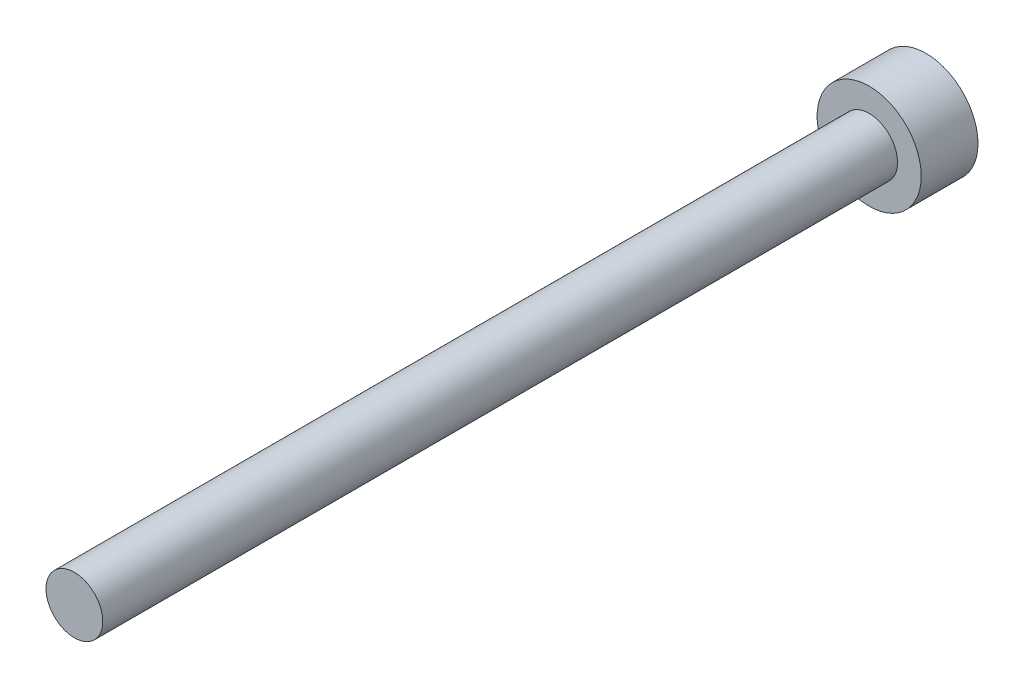
ISO-10303-21;
HEADER;
FILE_DESCRIPTION(('STEP AP214'),'2;1');
FILE_NAME('part.step','',(''),(''),'','','');
FILE_SCHEMA(('AUTOMOTIVE_DESIGN { 1 0 10303 214 1 1 1 1 }'));
ENDSEC;
DATA;
#1=APPLICATION_CONTEXT('core data for automotive mechanical design processes');
#2=APPLICATION_PROTOCOL_DEFINITION('international standard','automotive_design',2000,#1);
#3=PRODUCT_CONTEXT('',#1,'mechanical');
#4=PRODUCT('Part','Part','',(#3));
#5=PRODUCT_RELATED_PRODUCT_CATEGORY('part','',(#4));
#6=PRODUCT_DEFINITION_FORMATION('','',#4);
#7=PRODUCT_DEFINITION_CONTEXT('part definition',#1,'design');
#8=PRODUCT_DEFINITION('design','',#6,#7);
#9=PRODUCT_DEFINITION_SHAPE('','',#8);
#10=(LENGTH_UNIT() NAMED_UNIT(*) SI_UNIT(.MILLI.,.METRE.));
#11=(NAMED_UNIT(*) PLANE_ANGLE_UNIT() SI_UNIT($,.RADIAN.));
#12=(NAMED_UNIT(*) SI_UNIT($,.STERADIAN.) SOLID_ANGLE_UNIT());
#13=UNCERTAINTY_MEASURE_WITH_UNIT(LENGTH_MEASURE(1.E-05),#10,'distance_accuracy_value','');
#14=(GEOMETRIC_REPRESENTATION_CONTEXT(3) GLOBAL_UNCERTAINTY_ASSIGNED_CONTEXT((#13)) GLOBAL_UNIT_ASSIGNED_CONTEXT((#10,
#11,#12)) REPRESENTATION_CONTEXT('',''));
#15=CARTESIAN_POINT('',(0.,0.,0.));
#16=DIRECTION('',(0.,0.,1.));
#17=DIRECTION('',(1.,0.,0.));
#18=AXIS2_PLACEMENT_3D('',#15,#16,#17);
#19=CARTESIAN_POINT('',(0.,0.,-3.));
#20=DIRECTION('',(0.,0.,1.));
#21=DIRECTION('',(1.,0.,0.));
#22=AXIS2_PLACEMENT_3D('',#19,#20,#21);
#23=PLANE('',#22);
#24=CARTESIAN_POINT('',(0.,0.,-3.));
#25=DIRECTION('',(0.,0.,1.));
#26=DIRECTION('',(1.,0.,0.));
#27=AXIS2_PLACEMENT_3D('',#24,#25,#26);
#28=CIRCLE('',#27,2.75);
#29=CARTESIAN_POINT('',(2.75,0.,-3.));
#30=VERTEX_POINT('',#29);
#31=EDGE_CURVE('E112',#30,#30,#28,.T.);
#32=ORIENTED_EDGE('',*,*,#31,.F.);
#33=EDGE_LOOP('',(#32));
#34=FACE_BOUND('',#33,.T.);
#35=DIRECTION('',(-0.5,-0.866025403784439,0.));
#36=VECTOR('',#35,1.);
#37=CARTESIAN_POINT('',(1.08253175473055,-0.625,-3.));
#38=LINE('',#37,#36);
#39=CARTESIAN_POINT('',(1.44337567297406,0.,-3.));
#40=VERTEX_POINT('',#39);
#41=CARTESIAN_POINT('',(0.721687836487032,-1.25,-3.));
#42=VERTEX_POINT('',#41);
#43=EDGE_CURVE('E11',#40,#42,#38,.T.);
#44=ORIENTED_EDGE('',*,*,#43,.F.);
#45=DIRECTION('',(0.5,-0.866025403784439,0.));
#46=VECTOR('',#45,1.);
#47=CARTESIAN_POINT('',(1.08253175473055,0.625,-3.));
#48=LINE('',#47,#46);
#49=CARTESIAN_POINT('',(0.721687836487032,1.25,-3.));
#50=VERTEX_POINT('',#49);
#51=EDGE_CURVE('E50',#50,#40,#48,.T.);
#52=ORIENTED_EDGE('',*,*,#51,.F.);
#53=DIRECTION('',(1.,0.,0.));
#54=VECTOR('',#53,1.);
#55=CARTESIAN_POINT('',(0.,1.25,-3.));
#56=LINE('',#55,#54);
#57=CARTESIAN_POINT('',(-0.721687836487032,1.25,-3.));
#58=VERTEX_POINT('',#57);
#59=EDGE_CURVE('E133',#58,#50,#56,.T.);
#60=ORIENTED_EDGE('',*,*,#59,.F.);
#61=DIRECTION('',(0.5,0.866025403784439,0.));
#62=VECTOR('',#61,1.);
#63=CARTESIAN_POINT('',(-1.08253175473055,0.625,-3.));
#64=LINE('',#63,#62);
#65=CARTESIAN_POINT('',(-1.44337567297406,0.,-3.));
#66=VERTEX_POINT('',#65);
#67=EDGE_CURVE('E129',#66,#58,#64,.T.);
#68=ORIENTED_EDGE('',*,*,#67,.F.);
#69=DIRECTION('',(-0.5,0.866025403784439,0.));
#70=VECTOR('',#69,1.);
#71=CARTESIAN_POINT('',(-1.08253175473055,-0.624999999999999,-3.));
#72=LINE('',#71,#70);
#73=CARTESIAN_POINT('',(-0.721687836487033,-1.25,-3.));
#74=VERTEX_POINT('',#73);
#75=EDGE_CURVE('E130',#74,#66,#72,.T.);
#76=ORIENTED_EDGE('',*,*,#75,.F.);
#77=DIRECTION('',(-1.,0.,0.));
#78=VECTOR('',#77,1.);
#79=CARTESIAN_POINT('',(0.,-1.25,-3.));
#80=LINE('',#79,#78);
#81=EDGE_CURVE('E116',#42,#74,#80,.T.);
#82=ORIENTED_EDGE('',*,*,#81,.F.);
#83=EDGE_LOOP('',(#44,#52,#60,#68,#76,#82));
#84=FACE_BOUND('',#83,.T.);
#85=ADVANCED_FACE('F39',(#34,#84),#23,.F.);
#86=CARTESIAN_POINT('',(0.,0.,0.));
#87=DIRECTION('',(0.,0.,-1.));
#88=DIRECTION('',(-1.,0.,0.));
#89=AXIS2_PLACEMENT_3D('',#86,#87,#88);
#90=CYLINDRICAL_SURFACE('',#89,2.75);
#91=CARTESIAN_POINT('',(0.,0.,0.));
#92=DIRECTION('',(0.,0.,1.));
#93=DIRECTION('',(1.,0.,0.));
#94=AXIS2_PLACEMENT_3D('',#91,#92,#93);
#95=CIRCLE('',#94,2.75);
#96=CARTESIAN_POINT('',(2.75,0.,0.));
#97=VERTEX_POINT('',#96);
#98=EDGE_CURVE('E121',#97,#97,#95,.T.);
#99=ORIENTED_EDGE('',*,*,#98,.F.);
#100=EDGE_LOOP('',(#99));
#101=FACE_BOUND('',#100,.T.);
#102=ORIENTED_EDGE('',*,*,#31,.T.);
#103=EDGE_LOOP('',(#102));
#104=FACE_BOUND('',#103,.T.);
#105=ADVANCED_FACE('F41',(#101,#104),#90,.T.);
#106=CARTESIAN_POINT('',(0.,0.,0.));
#107=DIRECTION('',(0.,0.,1.));
#108=DIRECTION('',(1.,0.,0.));
#109=AXIS2_PLACEMENT_3D('',#106,#107,#108);
#110=PLANE('',#109);
#111=CARTESIAN_POINT('',(0.,0.,0.));
#112=DIRECTION('',(0.,0.,1.));
#113=DIRECTION('',(1.,0.,0.));
#114=AXIS2_PLACEMENT_3D('',#111,#112,#113);
#115=CIRCLE('',#114,1.5);
#116=CARTESIAN_POINT('',(-1.5,0.,0.));
#117=VERTEX_POINT('',#116);
#118=EDGE_CURVE('E119',#117,#117,#115,.T.);
#119=ORIENTED_EDGE('',*,*,#118,.F.);
#120=EDGE_LOOP('',(#119));
#121=FACE_BOUND('',#120,.T.);
#122=ORIENTED_EDGE('',*,*,#98,.T.);
#123=EDGE_LOOP('',(#122));
#124=FACE_BOUND('',#123,.T.);
#125=ADVANCED_FACE('F177',(#121,#124),#110,.T.);
#126=CARTESIAN_POINT('',(0.,0.,42.));
#127=DIRECTION('',(0.,0.,-1.));
#128=DIRECTION('',(-1.,0.,0.));
#129=AXIS2_PLACEMENT_3D('',#126,#127,#128);
#130=CYLINDRICAL_SURFACE('',#129,1.5);
#131=CARTESIAN_POINT('',(0.,0.,42.));
#132=DIRECTION('',(0.,0.,1.));
#133=DIRECTION('',(1.,0.,0.));
#134=AXIS2_PLACEMENT_3D('',#131,#132,#133);
#135=CIRCLE('',#134,1.5);
#136=CARTESIAN_POINT('',(-1.5,0.,42.));
#137=VERTEX_POINT('',#136);
#138=EDGE_CURVE('E110',#137,#137,#135,.T.);
#139=CARTESIAN_POINT('',(-1.5,0.,42.));
#140=CARTESIAN_POINT('',(-1.5,0.,41.5625));
#141=CARTESIAN_POINT('',(-1.5,0.,41.125));
#142=CARTESIAN_POINT('',(-1.5,0.,40.25));
#143=CARTESIAN_POINT('',(-1.5,0.,39.8125));
#144=CARTESIAN_POINT('',(-1.5,0.,38.9375));
#145=CARTESIAN_POINT('',(-1.5,0.,38.5));
#146=CARTESIAN_POINT('',(-1.5,0.,37.625));
#147=CARTESIAN_POINT('',(-1.5,0.,37.1875));
#148=CARTESIAN_POINT('',(-1.5,0.,36.3125));
#149=CARTESIAN_POINT('',(-1.5,0.,35.875));
#150=CARTESIAN_POINT('',(-1.5,0.,35.));
#151=CARTESIAN_POINT('',(-1.5,0.,34.5625));
#152=CARTESIAN_POINT('',(-1.5,0.,33.6875));
#153=CARTESIAN_POINT('',(-1.5,0.,33.25));
#154=CARTESIAN_POINT('',(-1.5,0.,32.375));
#155=CARTESIAN_POINT('',(-1.5,0.,31.9375));
#156=CARTESIAN_POINT('',(-1.5,0.,31.0625));
#157=CARTESIAN_POINT('',(-1.5,0.,30.625));
#158=CARTESIAN_POINT('',(-1.5,0.,29.75));
#159=CARTESIAN_POINT('',(-1.5,0.,29.3125));
#160=CARTESIAN_POINT('',(-1.5,0.,28.4375));
#161=CARTESIAN_POINT('',(-1.5,0.,28.));
#162=CARTESIAN_POINT('',(-1.5,0.,27.125));
#163=CARTESIAN_POINT('',(-1.5,0.,26.6875));
#164=CARTESIAN_POINT('',(-1.5,0.,25.8125));
#165=CARTESIAN_POINT('',(-1.5,0.,25.375));
#166=CARTESIAN_POINT('',(-1.5,0.,24.5));
#167=CARTESIAN_POINT('',(-1.5,0.,24.0625));
#168=CARTESIAN_POINT('',(-1.5,0.,23.1875));
#169=CARTESIAN_POINT('',(-1.5,0.,22.75));
#170=CARTESIAN_POINT('',(-1.5,0.,21.875));
#171=CARTESIAN_POINT('',(-1.5,0.,21.4375));
#172=CARTESIAN_POINT('',(-1.5,0.,20.5625));
#173=CARTESIAN_POINT('',(-1.5,0.,20.125));
#174=CARTESIAN_POINT('',(-1.5,0.,19.25));
#175=CARTESIAN_POINT('',(-1.5,0.,18.8125));
#176=CARTESIAN_POINT('',(-1.5,0.,17.9375));
#177=CARTESIAN_POINT('',(-1.5,0.,17.5));
#178=CARTESIAN_POINT('',(-1.5,0.,16.625));
#179=CARTESIAN_POINT('',(-1.5,0.,16.1875));
#180=CARTESIAN_POINT('',(-1.5,0.,15.3125));
#181=CARTESIAN_POINT('',(-1.5,0.,14.875));
#182=CARTESIAN_POINT('',(-1.5,0.,14.));
#183=CARTESIAN_POINT('',(-1.5,0.,13.5625));
#184=CARTESIAN_POINT('',(-1.5,0.,12.6875));
#185=CARTESIAN_POINT('',(-1.5,0.,12.25));
#186=CARTESIAN_POINT('',(-1.5,0.,11.375));
#187=CARTESIAN_POINT('',(-1.5,0.,10.9375));
#188=CARTESIAN_POINT('',(-1.5,0.,10.0625));
#189=CARTESIAN_POINT('',(-1.5,0.,9.625));
#190=CARTESIAN_POINT('',(-1.5,0.,8.75));
#191=CARTESIAN_POINT('',(-1.5,0.,8.3125));
#192=CARTESIAN_POINT('',(-1.5,0.,7.4375));
#193=CARTESIAN_POINT('',(-1.5,0.,7.));
#194=CARTESIAN_POINT('',(-1.5,0.,6.125));
#195=CARTESIAN_POINT('',(-1.5,0.,5.6875));
#196=CARTESIAN_POINT('',(-1.5,0.,4.8125));
#197=CARTESIAN_POINT('',(-1.5,0.,4.375));
#198=CARTESIAN_POINT('',(-1.5,0.,3.5));
#199=CARTESIAN_POINT('',(-1.5,0.,3.0625));
#200=CARTESIAN_POINT('',(-1.5,0.,2.1875));
#201=CARTESIAN_POINT('',(-1.5,0.,1.75));
#202=CARTESIAN_POINT('',(-1.5,0.,0.875000000000001));
#203=CARTESIAN_POINT('',(-1.5,0.,0.4375));
#204=CARTESIAN_POINT('',(-1.5,0.,0.));
#205=B_SPLINE_CURVE_WITH_KNOTS('',3,(#139,#140,#141,#142,#143,#144,#145,#146,#147,#148,#149,
#150,#151,#152,#153,#154,#155,#156,#157,#158,#159,#160,#161,#162,#163,#164,#165,#166,#167,#168,
#169,#170,#171,#172,#173,#174,#175,#176,#177,#178,#179,#180,#181,#182,#183,#184,#185,#186,#187,
#188,#189,#190,#191,#192,#193,#194,#195,#196,#197,#198,#199,#200,#201,#202,#203,#204),
.UNSPECIFIED.,.F.,.F.,(4,2,2,2,2,2,2,2,2,2,2,2,2,2,2,2,2,2,2,2,2,2,2,2,2,2,2,2,2,2,2,2,4),(0.,
1.31249999999999,2.625,3.9375,5.25,6.5625,7.87499999999999,9.18749999999999,10.5,11.8125,13.125,
14.4375,15.75,17.0625,18.375,19.6875,21.,22.3125,23.625,24.9375,26.25,27.5625,28.875,30.1875,
31.5,32.8125,34.125,35.4375,36.75,38.0625,39.375,40.6875,42.),.UNSPECIFIED.);
#206=EDGE_CURVE('BSEAM184',#137,#117,#205,.T.);
#207=ORIENTED_EDGE('',*,*,#138,.F.);
#208=ORIENTED_EDGE('',*,*,#118,.T.);
#209=ORIENTED_EDGE('',*,*,#206,.T.);
#210=ORIENTED_EDGE('',*,*,#206,.F.);
#211=EDGE_LOOP('',(#207,#209,#208,#210));
#212=FACE_BOUND('',#211,.T.);
#213=ADVANCED_FACE('F184',(#212),#130,.T.);
#214=CARTESIAN_POINT('',(0.,0.,42.));
#215=DIRECTION('',(0.,0.,1.));
#216=DIRECTION('',(1.,0.,0.));
#217=AXIS2_PLACEMENT_3D('',#214,#215,#216);
#218=PLANE('',#217);
#219=ORIENTED_EDGE('',*,*,#138,.T.);
#220=EDGE_LOOP('',(#219));
#221=FACE_BOUND('',#220,.T.);
#222=ADVANCED_FACE('F187',(#221),#218,.T.);
#223=CARTESIAN_POINT('',(0.721687836487032,-1.25,-1.35));
#224=DIRECTION('',(-0.866025403784439,0.5,0.));
#225=DIRECTION('',(-0.5,-0.866025403784439,0.));
#226=AXIS2_PLACEMENT_3D('',#223,#224,#225);
#227=PLANE('',#226);
#228=ORIENTED_EDGE('',*,*,#43,.T.);
#229=DIRECTION('',(0.,0.,-1.));
#230=VECTOR('',#229,1.);
#231=CARTESIAN_POINT('',(0.721687836487032,-1.25,-1.35));
#232=LINE('',#231,#230);
#233=CARTESIAN_POINT('',(0.721687836487032,-1.25,-1.35));
#234=VERTEX_POINT('',#233);
#235=EDGE_CURVE('E53',#234,#42,#232,.T.);
#236=ORIENTED_EDGE('',*,*,#235,.F.);
#237=DIRECTION('',(0.5,0.866025403784439,0.));
#238=VECTOR('',#237,1.);
#239=CARTESIAN_POINT('',(0.721687836487032,-1.25,-1.35));
#240=LINE('',#239,#238);
#241=CARTESIAN_POINT('',(1.44337567297406,0.,-1.35));
#242=VERTEX_POINT('',#241);
#243=EDGE_CURVE('E96',#234,#242,#240,.T.);
#244=ORIENTED_EDGE('',*,*,#243,.T.);
#245=DIRECTION('',(0.,0.,-1.));
#246=VECTOR('',#245,1.);
#247=CARTESIAN_POINT('',(1.44337567297406,0.,-1.35));
#248=LINE('',#247,#246);
#249=EDGE_CURVE('E103',#242,#40,#248,.T.);
#250=ORIENTED_EDGE('',*,*,#249,.T.);
#251=EDGE_LOOP('',(#228,#236,#244,#250));
#252=FACE_BOUND('',#251,.T.);
#253=ADVANCED_FACE('F105',(#252),#227,.T.);
#254=CARTESIAN_POINT('',(1.44337567297406,0.,-1.35));
#255=DIRECTION('',(-0.866025403784439,-0.5,0.));
#256=DIRECTION('',(0.5,-0.866025403784439,0.));
#257=AXIS2_PLACEMENT_3D('',#254,#255,#256);
#258=PLANE('',#257);
#259=ORIENTED_EDGE('',*,*,#51,.T.);
#260=ORIENTED_EDGE('',*,*,#249,.F.);
#261=DIRECTION('',(-0.5,0.866025403784439,0.));
#262=VECTOR('',#261,1.);
#263=CARTESIAN_POINT('',(1.44337567297406,0.,-1.35));
#264=LINE('',#263,#262);
#265=CARTESIAN_POINT('',(0.721687836487032,1.25,-1.35));
#266=VERTEX_POINT('',#265);
#267=EDGE_CURVE('E95',#242,#266,#264,.T.);
#268=ORIENTED_EDGE('',*,*,#267,.T.);
#269=DIRECTION('',(0.,0.,-1.));
#270=VECTOR('',#269,1.);
#271=CARTESIAN_POINT('',(0.721687836487032,1.25,-1.35));
#272=LINE('',#271,#270);
#273=EDGE_CURVE('E107',#266,#50,#272,.T.);
#274=ORIENTED_EDGE('',*,*,#273,.T.);
#275=EDGE_LOOP('',(#259,#260,#268,#274));
#276=FACE_BOUND('',#275,.T.);
#277=ADVANCED_FACE('F106',(#276),#258,.T.);
#278=CARTESIAN_POINT('',(0.721687836487032,1.25,-1.35));
#279=DIRECTION('',(0.,-1.,0.));
#280=DIRECTION('',(1.,0.,0.));
#281=AXIS2_PLACEMENT_3D('',#278,#279,#280);
#282=PLANE('',#281);
#283=ORIENTED_EDGE('',*,*,#59,.T.);
#284=ORIENTED_EDGE('',*,*,#273,.F.);
#285=DIRECTION('',(-1.,0.,0.));
#286=VECTOR('',#285,1.);
#287=CARTESIAN_POINT('',(0.721687836487032,1.25,-1.35));
#288=LINE('',#287,#286);
#289=CARTESIAN_POINT('',(-0.721687836487032,1.25,-1.35));
#290=VERTEX_POINT('',#289);
#291=EDGE_CURVE('E98',#266,#290,#288,.T.);
#292=ORIENTED_EDGE('',*,*,#291,.T.);
#293=DIRECTION('',(0.,0.,-1.));
#294=VECTOR('',#293,1.);
#295=CARTESIAN_POINT('',(-0.721687836487032,1.25,-1.35));
#296=LINE('',#295,#294);
#297=EDGE_CURVE('E114',#290,#58,#296,.T.);
#298=ORIENTED_EDGE('',*,*,#297,.T.);
#299=EDGE_LOOP('',(#283,#284,#292,#298));
#300=FACE_BOUND('',#299,.T.);
#301=ADVANCED_FACE('F131',(#300),#282,.T.);
#302=CARTESIAN_POINT('',(-0.721687836487032,1.25,-1.35));
#303=DIRECTION('',(0.866025403784439,-0.5,0.));
#304=DIRECTION('',(0.5,0.866025403784439,0.));
#305=AXIS2_PLACEMENT_3D('',#302,#303,#304);
#306=PLANE('',#305);
#307=ORIENTED_EDGE('',*,*,#67,.T.);
#308=ORIENTED_EDGE('',*,*,#297,.F.);
#309=DIRECTION('',(-0.5,-0.866025403784439,0.));
#310=VECTOR('',#309,1.);
#311=CARTESIAN_POINT('',(-0.721687836487032,1.25,-1.35));
#312=LINE('',#311,#310);
#313=CARTESIAN_POINT('',(-1.44337567297406,0.,-1.35));
#314=VERTEX_POINT('',#313);
#315=EDGE_CURVE('E157',#290,#314,#312,.T.);
#316=ORIENTED_EDGE('',*,*,#315,.T.);
#317=DIRECTION('',(0.,0.,-1.));
#318=VECTOR('',#317,1.);
#319=CARTESIAN_POINT('',(-1.44337567297406,0.,-1.35));
#320=LINE('',#319,#318);
#321=EDGE_CURVE('E151',#314,#66,#320,.T.);
#322=ORIENTED_EDGE('',*,*,#321,.T.);
#323=EDGE_LOOP('',(#307,#308,#316,#322));
#324=FACE_BOUND('',#323,.T.);
#325=ADVANCED_FACE('F165',(#324),#306,.T.);
#326=CARTESIAN_POINT('',(-1.44337567297406,0.,-1.35));
#327=DIRECTION('',(0.866025403784439,0.5,0.));
#328=DIRECTION('',(-0.5,0.866025403784439,0.));
#329=AXIS2_PLACEMENT_3D('',#326,#327,#328);
#330=PLANE('',#329);
#331=ORIENTED_EDGE('',*,*,#75,.T.);
#332=ORIENTED_EDGE('',*,*,#321,.F.);
#333=DIRECTION('',(0.5,-0.866025403784439,0.));
#334=VECTOR('',#333,1.);
#335=CARTESIAN_POINT('',(-1.44337567297406,0.,-1.35));
#336=LINE('',#335,#334);
#337=CARTESIAN_POINT('',(-0.721687836487033,-1.25,-1.35));
#338=VERTEX_POINT('',#337);
#339=EDGE_CURVE('E147',#314,#338,#336,.T.);
#340=ORIENTED_EDGE('',*,*,#339,.T.);
#341=DIRECTION('',(0.,0.,-1.));
#342=VECTOR('',#341,1.);
#343=CARTESIAN_POINT('',(-0.721687836487033,-1.25,-1.35));
#344=LINE('',#343,#342);
#345=EDGE_CURVE('E145',#338,#74,#344,.T.);
#346=ORIENTED_EDGE('',*,*,#345,.T.);
#347=EDGE_LOOP('',(#331,#332,#340,#346));
#348=FACE_BOUND('',#347,.T.);
#349=ADVANCED_FACE('F148',(#348),#330,.T.);
#350=CARTESIAN_POINT('',(-0.721687836487033,-1.25,-1.35));
#351=DIRECTION('',(0.,1.,0.));
#352=DIRECTION('',(-1.,0.,0.));
#353=AXIS2_PLACEMENT_3D('',#350,#351,#352);
#354=PLANE('',#353);
#355=ORIENTED_EDGE('',*,*,#81,.T.);
#356=ORIENTED_EDGE('',*,*,#345,.F.);
#357=DIRECTION('',(1.,0.,0.));
#358=VECTOR('',#357,1.);
#359=CARTESIAN_POINT('',(-0.721687836487033,-1.25,-1.35));
#360=LINE('',#359,#358);
#361=EDGE_CURVE('E152',#338,#234,#360,.T.);
#362=ORIENTED_EDGE('',*,*,#361,.T.);
#363=ORIENTED_EDGE('',*,*,#235,.T.);
#364=EDGE_LOOP('',(#355,#356,#362,#363));
#365=FACE_BOUND('',#364,.T.);
#366=ADVANCED_FACE('F141',(#365),#354,.T.);
#367=CARTESIAN_POINT('',(0.,0.,-1.35));
#368=DIRECTION('',(0.,0.,1.));
#369=DIRECTION('',(1.,0.,0.));
#370=AXIS2_PLACEMENT_3D('',#367,#368,#369);
#371=PLANE('',#370);
#372=ORIENTED_EDGE('',*,*,#243,.F.);
#373=ORIENTED_EDGE('',*,*,#361,.F.);
#374=ORIENTED_EDGE('',*,*,#339,.F.);
#375=ORIENTED_EDGE('',*,*,#315,.F.);
#376=ORIENTED_EDGE('',*,*,#291,.F.);
#377=ORIENTED_EDGE('',*,*,#267,.F.);
#378=EDGE_LOOP('',(#372,#373,#374,#375,#376,#377));
#379=FACE_BOUND('',#378,.T.);
#380=ADVANCED_FACE('F94',(#379),#371,.F.);
#381=CLOSED_SHELL('',(#85,#105,#125,#213,#222,#253,#277,#301,#325,#349,#366,#380));
#382=MANIFOLD_SOLID_BREP('B2',#381);
#383=ADVANCED_BREP_SHAPE_REPRESENTATION('',(#18,#382),#14);
#384=SHAPE_DEFINITION_REPRESENTATION(#9,#383);
ENDSEC;
END-ISO-10303-21;
